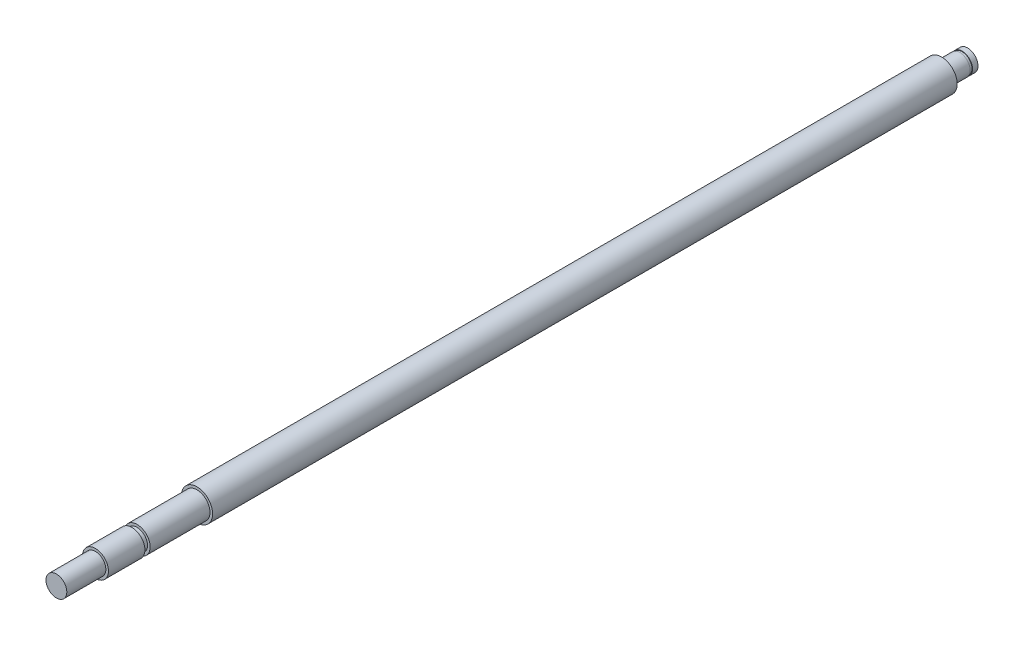
ISO-10303-21;
HEADER;
FILE_DESCRIPTION(('STEP AP214'),'2;1');
FILE_NAME('part.step','',(''),(''),'','','');
FILE_SCHEMA(('AUTOMOTIVE_DESIGN { 1 0 10303 214 1 1 1 1 }'));
ENDSEC;
DATA;
#1=APPLICATION_CONTEXT('core data for automotive mechanical design processes');
#2=APPLICATION_PROTOCOL_DEFINITION('international standard','automotive_design',2000,#1);
#3=PRODUCT_CONTEXT('',#1,'mechanical');
#4=PRODUCT('Part','Part','',(#3));
#5=PRODUCT_RELATED_PRODUCT_CATEGORY('part','',(#4));
#6=PRODUCT_DEFINITION_FORMATION('','',#4);
#7=PRODUCT_DEFINITION_CONTEXT('part definition',#1,'design');
#8=PRODUCT_DEFINITION('design','',#6,#7);
#9=PRODUCT_DEFINITION_SHAPE('','',#8);
#10=(LENGTH_UNIT() NAMED_UNIT(*) SI_UNIT(.MILLI.,.METRE.));
#11=(NAMED_UNIT(*) PLANE_ANGLE_UNIT() SI_UNIT($,.RADIAN.));
#12=(NAMED_UNIT(*) SI_UNIT($,.STERADIAN.) SOLID_ANGLE_UNIT());
#13=UNCERTAINTY_MEASURE_WITH_UNIT(LENGTH_MEASURE(1.E-05),#10,'distance_accuracy_value','');
#14=(GEOMETRIC_REPRESENTATION_CONTEXT(3) GLOBAL_UNCERTAINTY_ASSIGNED_CONTEXT((#13)) GLOBAL_UNIT_ASSIGNED_CONTEXT((#10,
#11,#12)) REPRESENTATION_CONTEXT('',''));
#15=CARTESIAN_POINT('',(0.,0.,0.));
#16=DIRECTION('',(0.,0.,1.));
#17=DIRECTION('',(1.,0.,0.));
#18=AXIS2_PLACEMENT_3D('',#15,#16,#17);
#19=CARTESIAN_POINT('',(0.,4.,197.));
#20=DIRECTION('',(0.,0.,-1.));
#21=DIRECTION('',(-1.,0.,0.));
#22=AXIS2_PLACEMENT_3D('',#19,#20,#21);
#23=PLANE('',#22);
#24=CARTESIAN_POINT('',(0.,0.,197.));
#25=DIRECTION('',(0.,0.,1.));
#26=DIRECTION('',(1.,0.,0.));
#27=AXIS2_PLACEMENT_3D('',#24,#25,#26);
#28=CIRCLE('',#27,4.);
#29=CARTESIAN_POINT('',(4.,0.,197.));
#30=VERTEX_POINT('',#29);
#31=EDGE_CURVE('E104',#30,#30,#28,.T.);
#32=ORIENTED_EDGE('',*,*,#31,.T.);
#33=EDGE_LOOP('',(#32));
#34=FACE_BOUND('',#33,.T.);
#35=ADVANCED_FACE('F37',(#34),#23,.F.);
#36=CARTESIAN_POINT('',(0.,0.,-153.));
#37=DIRECTION('',(0.,0.,1.));
#38=DIRECTION('',(1.,0.,0.));
#39=AXIS2_PLACEMENT_3D('',#36,#37,#38);
#40=PLANE('',#39);
#41=CARTESIAN_POINT('',(0.,0.,-153.));
#42=DIRECTION('',(0.,0.,1.));
#43=DIRECTION('',(1.,0.,0.));
#44=AXIS2_PLACEMENT_3D('',#41,#42,#43);
#45=CIRCLE('',#44,3.99999999999996);
#46=CARTESIAN_POINT('',(3.99999999999996,0.,-153.));
#47=VERTEX_POINT('',#46);
#48=EDGE_CURVE('E10',#47,#47,#45,.T.);
#49=ORIENTED_EDGE('',*,*,#48,.F.);
#50=EDGE_LOOP('',(#49));
#51=FACE_BOUND('',#50,.T.);
#52=ADVANCED_FACE('F195',(#51),#40,.F.);
#53=CARTESIAN_POINT('',(0.,0.,197.));
#54=DIRECTION('',(0.,0.,1.));
#55=DIRECTION('',(1.,0.,0.));
#56=AXIS2_PLACEMENT_3D('',#53,#54,#55);
#57=CYLINDRICAL_SURFACE('',#56,3.99999999999996);
#58=CARTESIAN_POINT('',(0.,0.,-150.9));
#59=DIRECTION('',(0.,0.,1.));
#60=DIRECTION('',(1.,0.,0.));
#61=AXIS2_PLACEMENT_3D('',#58,#59,#60);
#62=CIRCLE('',#61,3.99999999999996);
#63=CARTESIAN_POINT('',(3.99999999999996,0.,-150.9));
#64=VERTEX_POINT('',#63);
#65=EDGE_CURVE('E44',#64,#64,#62,.T.);
#66=ORIENTED_EDGE('',*,*,#65,.F.);
#67=EDGE_LOOP('',(#66));
#68=FACE_BOUND('',#67,.T.);
#69=ORIENTED_EDGE('',*,*,#48,.T.);
#70=EDGE_LOOP('',(#69));
#71=FACE_BOUND('',#70,.T.);
#72=ADVANCED_FACE('F190',(#68,#71),#57,.T.);
#73=CARTESIAN_POINT('',(0.,3.99999999999996,-150.9));
#74=DIRECTION('',(0.,0.,-1.));
#75=DIRECTION('',(-1.,0.,0.));
#76=AXIS2_PLACEMENT_3D('',#73,#74,#75);
#77=PLANE('',#76);
#78=CARTESIAN_POINT('',(0.,0.,-150.9));
#79=DIRECTION('',(0.,0.,1.));
#80=DIRECTION('',(1.,0.,0.));
#81=AXIS2_PLACEMENT_3D('',#78,#79,#80);
#82=CIRCLE('',#81,3.79999999999996);
#83=CARTESIAN_POINT('',(3.79999999999996,0.,-150.9));
#84=VERTEX_POINT('',#83);
#85=EDGE_CURVE('E49',#84,#84,#82,.T.);
#86=ORIENTED_EDGE('',*,*,#85,.F.);
#87=EDGE_LOOP('',(#86));
#88=FACE_BOUND('',#87,.T.);
#89=ORIENTED_EDGE('',*,*,#65,.T.);
#90=EDGE_LOOP('',(#89));
#91=FACE_BOUND('',#90,.T.);
#92=ADVANCED_FACE('F185',(#88,#91),#77,.F.);
#93=CARTESIAN_POINT('',(0.,0.,197.));
#94=DIRECTION('',(0.,0.,1.));
#95=DIRECTION('',(1.,0.,0.));
#96=AXIS2_PLACEMENT_3D('',#93,#94,#95);
#97=CYLINDRICAL_SURFACE('',#96,3.79999999999996);
#98=CARTESIAN_POINT('',(0.,0.,-150.));
#99=DIRECTION('',(0.,0.,1.));
#100=DIRECTION('',(1.,0.,0.));
#101=AXIS2_PLACEMENT_3D('',#98,#99,#100);
#102=CIRCLE('',#101,3.79999999999996);
#103=CARTESIAN_POINT('',(3.79999999999996,0.,-150.));
#104=VERTEX_POINT('',#103);
#105=EDGE_CURVE('E54',#104,#104,#102,.T.);
#106=ORIENTED_EDGE('',*,*,#105,.F.);
#107=EDGE_LOOP('',(#106));
#108=FACE_BOUND('',#107,.T.);
#109=ORIENTED_EDGE('',*,*,#85,.T.);
#110=EDGE_LOOP('',(#109));
#111=FACE_BOUND('',#110,.T.);
#112=ADVANCED_FACE('F179',(#108,#111),#97,.T.);
#113=CARTESIAN_POINT('',(0.,3.79999999999996,-150.));
#114=DIRECTION('',(0.,0.,1.));
#115=DIRECTION('',(1.,0.,0.));
#116=AXIS2_PLACEMENT_3D('',#113,#114,#115);
#117=PLANE('',#116);
#118=CARTESIAN_POINT('',(0.,0.,-150.));
#119=DIRECTION('',(0.,0.,1.));
#120=DIRECTION('',(1.,0.,0.));
#121=AXIS2_PLACEMENT_3D('',#118,#119,#120);
#122=CIRCLE('',#121,3.99999999999996);
#123=CARTESIAN_POINT('',(3.99999999999996,0.,-150.));
#124=VERTEX_POINT('',#123);
#125=EDGE_CURVE('E60',#124,#124,#122,.T.);
#126=ORIENTED_EDGE('',*,*,#125,.F.);
#127=EDGE_LOOP('',(#126));
#128=FACE_BOUND('',#127,.T.);
#129=ORIENTED_EDGE('',*,*,#105,.T.);
#130=EDGE_LOOP('',(#129));
#131=FACE_BOUND('',#130,.T.);
#132=ADVANCED_FACE('F173',(#128,#131),#117,.F.);
#133=CARTESIAN_POINT('',(0.,0.,197.));
#134=DIRECTION('',(0.,0.,1.));
#135=DIRECTION('',(1.,0.,0.));
#136=AXIS2_PLACEMENT_3D('',#133,#134,#135);
#137=CYLINDRICAL_SURFACE('',#136,3.99999999999996);
#138=CARTESIAN_POINT('',(0.,0.,-143.));
#139=DIRECTION('',(0.,0.,1.));
#140=DIRECTION('',(1.,0.,0.));
#141=AXIS2_PLACEMENT_3D('',#138,#139,#140);
#142=CIRCLE('',#141,3.99999999999996);
#143=CARTESIAN_POINT('',(3.99999999999996,0.,-143.));
#144=VERTEX_POINT('',#143);
#145=EDGE_CURVE('E64',#144,#144,#142,.T.);
#146=ORIENTED_EDGE('',*,*,#145,.F.);
#147=EDGE_LOOP('',(#146));
#148=FACE_BOUND('',#147,.T.);
#149=ORIENTED_EDGE('',*,*,#125,.T.);
#150=EDGE_LOOP('',(#149));
#151=FACE_BOUND('',#150,.T.);
#152=ADVANCED_FACE('F167',(#148,#151),#137,.T.);
#153=CARTESIAN_POINT('',(0.,3.99999999999996,-143.));
#154=DIRECTION('',(0.,0.,1.));
#155=DIRECTION('',(1.,0.,0.));
#156=AXIS2_PLACEMENT_3D('',#153,#154,#155);
#157=PLANE('',#156);
#158=CARTESIAN_POINT('',(0.,0.,-143.));
#159=DIRECTION('',(0.,0.,1.));
#160=DIRECTION('',(1.,0.,0.));
#161=AXIS2_PLACEMENT_3D('',#158,#159,#160);
#162=CIRCLE('',#161,5.99999999999995);
#163=CARTESIAN_POINT('',(5.99999999999995,0.,-143.));
#164=VERTEX_POINT('',#163);
#165=EDGE_CURVE('E68',#164,#164,#162,.T.);
#166=ORIENTED_EDGE('',*,*,#165,.F.);
#167=EDGE_LOOP('',(#166));
#168=FACE_BOUND('',#167,.T.);
#169=ORIENTED_EDGE('',*,*,#145,.T.);
#170=EDGE_LOOP('',(#169));
#171=FACE_BOUND('',#170,.T.);
#172=ADVANCED_FACE('F161',(#168,#171),#157,.F.);
#173=CARTESIAN_POINT('',(0.,0.,197.));
#174=DIRECTION('',(0.,0.,1.));
#175=DIRECTION('',(1.,0.,0.));
#176=AXIS2_PLACEMENT_3D('',#173,#174,#175);
#177=CYLINDRICAL_SURFACE('',#176,5.99999999999995);
#178=CARTESIAN_POINT('',(0.,0.,143.));
#179=DIRECTION('',(0.,0.,1.));
#180=DIRECTION('',(1.,0.,0.));
#181=AXIS2_PLACEMENT_3D('',#178,#179,#180);
#182=CIRCLE('',#181,5.99999999999995);
#183=CARTESIAN_POINT('',(5.99999999999995,0.,143.));
#184=VERTEX_POINT('',#183);
#185=EDGE_CURVE('E72',#184,#184,#182,.T.);
#186=ORIENTED_EDGE('',*,*,#185,.F.);
#187=EDGE_LOOP('',(#186));
#188=FACE_BOUND('',#187,.T.);
#189=ORIENTED_EDGE('',*,*,#165,.T.);
#190=EDGE_LOOP('',(#189));
#191=FACE_BOUND('',#190,.T.);
#192=ADVANCED_FACE('F155',(#188,#191),#177,.T.);
#193=CARTESIAN_POINT('',(0.,5.99999999999995,143.));
#194=DIRECTION('',(0.,0.,-1.));
#195=DIRECTION('',(-1.,0.,0.));
#196=AXIS2_PLACEMENT_3D('',#193,#194,#195);
#197=PLANE('',#196);
#198=CARTESIAN_POINT('',(0.,0.,143.));
#199=DIRECTION('',(0.,0.,1.));
#200=DIRECTION('',(1.,0.,0.));
#201=AXIS2_PLACEMENT_3D('',#198,#199,#200);
#202=CIRCLE('',#201,5.00000000000001);
#203=CARTESIAN_POINT('',(5.00000000000001,0.,143.));
#204=VERTEX_POINT('',#203);
#205=EDGE_CURVE('E76',#204,#204,#202,.T.);
#206=ORIENTED_EDGE('',*,*,#205,.F.);
#207=EDGE_LOOP('',(#206));
#208=FACE_BOUND('',#207,.T.);
#209=ORIENTED_EDGE('',*,*,#185,.T.);
#210=EDGE_LOOP('',(#209));
#211=FACE_BOUND('',#210,.T.);
#212=ADVANCED_FACE('F149',(#208,#211),#197,.F.);
#213=CARTESIAN_POINT('',(0.,0.,197.));
#214=DIRECTION('',(0.,0.,1.));
#215=DIRECTION('',(1.,0.,0.));
#216=AXIS2_PLACEMENT_3D('',#213,#214,#215);
#217=CYLINDRICAL_SURFACE('',#216,5.00000000000001);
#218=CARTESIAN_POINT('',(0.,0.,166.));
#219=DIRECTION('',(0.,0.,1.));
#220=DIRECTION('',(1.,0.,0.));
#221=AXIS2_PLACEMENT_3D('',#218,#219,#220);
#222=CIRCLE('',#221,5.);
#223=CARTESIAN_POINT('',(5.,0.,166.));
#224=VERTEX_POINT('',#223);
#225=EDGE_CURVE('E80',#224,#224,#222,.T.);
#226=ORIENTED_EDGE('',*,*,#225,.F.);
#227=EDGE_LOOP('',(#226));
#228=FACE_BOUND('',#227,.T.);
#229=ORIENTED_EDGE('',*,*,#205,.T.);
#230=EDGE_LOOP('',(#229));
#231=FACE_BOUND('',#230,.T.);
#232=ADVANCED_FACE('F143',(#228,#231),#217,.T.);
#233=CARTESIAN_POINT('',(0.,5.,166.));
#234=DIRECTION('',(0.,0.,-1.));
#235=DIRECTION('',(-1.,0.,0.));
#236=AXIS2_PLACEMENT_3D('',#233,#234,#235);
#237=PLANE('',#236);
#238=CARTESIAN_POINT('',(0.,0.,166.));
#239=DIRECTION('',(0.,0.,1.));
#240=DIRECTION('',(1.,0.,0.));
#241=AXIS2_PLACEMENT_3D('',#238,#239,#240);
#242=CIRCLE('',#241,4.);
#243=CARTESIAN_POINT('',(4.,0.,166.));
#244=VERTEX_POINT('',#243);
#245=EDGE_CURVE('E84',#244,#244,#242,.T.);
#246=ORIENTED_EDGE('',*,*,#245,.F.);
#247=EDGE_LOOP('',(#246));
#248=FACE_BOUND('',#247,.T.);
#249=ORIENTED_EDGE('',*,*,#225,.T.);
#250=EDGE_LOOP('',(#249));
#251=FACE_BOUND('',#250,.T.);
#252=ADVANCED_FACE('F137',(#248,#251),#237,.F.);
#253=CARTESIAN_POINT('',(0.,0.,197.));
#254=DIRECTION('',(0.,0.,1.));
#255=DIRECTION('',(1.,0.,0.));
#256=AXIS2_PLACEMENT_3D('',#253,#254,#255);
#257=CYLINDRICAL_SURFACE('',#256,4.);
#258=CARTESIAN_POINT('',(0.,0.,168.));
#259=DIRECTION('',(0.,0.,1.));
#260=DIRECTION('',(1.,0.,0.));
#261=AXIS2_PLACEMENT_3D('',#258,#259,#260);
#262=CIRCLE('',#261,4.);
#263=CARTESIAN_POINT('',(4.,0.,168.));
#264=VERTEX_POINT('',#263);
#265=EDGE_CURVE('E88',#264,#264,#262,.T.);
#266=ORIENTED_EDGE('',*,*,#265,.F.);
#267=EDGE_LOOP('',(#266));
#268=FACE_BOUND('',#267,.T.);
#269=ORIENTED_EDGE('',*,*,#245,.T.);
#270=EDGE_LOOP('',(#269));
#271=FACE_BOUND('',#270,.T.);
#272=ADVANCED_FACE('F131',(#268,#271),#257,.T.);
#273=CARTESIAN_POINT('',(0.,4.,168.));
#274=DIRECTION('',(0.,0.,1.));
#275=DIRECTION('',(1.,0.,0.));
#276=AXIS2_PLACEMENT_3D('',#273,#274,#275);
#277=PLANE('',#276);
#278=CARTESIAN_POINT('',(0.,0.,168.));
#279=DIRECTION('',(0.,0.,1.));
#280=DIRECTION('',(1.,0.,0.));
#281=AXIS2_PLACEMENT_3D('',#278,#279,#280);
#282=CIRCLE('',#281,5.);
#283=CARTESIAN_POINT('',(5.,0.,168.));
#284=VERTEX_POINT('',#283);
#285=EDGE_CURVE('E92',#284,#284,#282,.T.);
#286=ORIENTED_EDGE('',*,*,#285,.F.);
#287=EDGE_LOOP('',(#286));
#288=FACE_BOUND('',#287,.T.);
#289=ORIENTED_EDGE('',*,*,#265,.T.);
#290=EDGE_LOOP('',(#289));
#291=FACE_BOUND('',#290,.T.);
#292=ADVANCED_FACE('F125',(#288,#291),#277,.F.);
#293=CARTESIAN_POINT('',(0.,0.,197.));
#294=DIRECTION('',(0.,0.,1.));
#295=DIRECTION('',(1.,0.,0.));
#296=AXIS2_PLACEMENT_3D('',#293,#294,#295);
#297=CYLINDRICAL_SURFACE('',#296,5.);
#298=CARTESIAN_POINT('',(0.,0.,182.));
#299=DIRECTION('',(0.,0.,1.));
#300=DIRECTION('',(1.,0.,0.));
#301=AXIS2_PLACEMENT_3D('',#298,#299,#300);
#302=CIRCLE('',#301,5.);
#303=CARTESIAN_POINT('',(5.,0.,182.));
#304=VERTEX_POINT('',#303);
#305=EDGE_CURVE('E96',#304,#304,#302,.T.);
#306=ORIENTED_EDGE('',*,*,#305,.F.);
#307=EDGE_LOOP('',(#306));
#308=FACE_BOUND('',#307,.T.);
#309=ORIENTED_EDGE('',*,*,#285,.T.);
#310=EDGE_LOOP('',(#309));
#311=FACE_BOUND('',#310,.T.);
#312=ADVANCED_FACE('F119',(#308,#311),#297,.T.);
#313=CARTESIAN_POINT('',(0.,5.,182.));
#314=DIRECTION('',(0.,0.,-1.));
#315=DIRECTION('',(-1.,0.,0.));
#316=AXIS2_PLACEMENT_3D('',#313,#314,#315);
#317=PLANE('',#316);
#318=CARTESIAN_POINT('',(0.,0.,182.));
#319=DIRECTION('',(0.,0.,1.));
#320=DIRECTION('',(1.,0.,0.));
#321=AXIS2_PLACEMENT_3D('',#318,#319,#320);
#322=CIRCLE('',#321,4.);
#323=CARTESIAN_POINT('',(4.,0.,182.));
#324=VERTEX_POINT('',#323);
#325=EDGE_CURVE('E100',#324,#324,#322,.T.);
#326=ORIENTED_EDGE('',*,*,#325,.F.);
#327=EDGE_LOOP('',(#326));
#328=FACE_BOUND('',#327,.T.);
#329=ORIENTED_EDGE('',*,*,#305,.T.);
#330=EDGE_LOOP('',(#329));
#331=FACE_BOUND('',#330,.T.);
#332=ADVANCED_FACE('F113',(#328,#331),#317,.F.);
#333=CARTESIAN_POINT('',(0.,0.,197.));
#334=DIRECTION('',(0.,0.,1.));
#335=DIRECTION('',(1.,0.,0.));
#336=AXIS2_PLACEMENT_3D('',#333,#334,#335);
#337=CYLINDRICAL_SURFACE('',#336,4.);
#338=ORIENTED_EDGE('',*,*,#31,.F.);
#339=EDGE_LOOP('',(#338));
#340=FACE_BOUND('',#339,.T.);
#341=ORIENTED_EDGE('',*,*,#325,.T.);
#342=EDGE_LOOP('',(#341));
#343=FACE_BOUND('',#342,.T.);
#344=ADVANCED_FACE('F110',(#340,#343),#337,.T.);
#345=CLOSED_SHELL('',(#35,#52,#72,#92,#112,#132,#152,#172,#192,#212,#232,#252,#272,#292,#312,
#332,#344));
#346=MANIFOLD_SOLID_BREP('B2',#345);
#347=ADVANCED_BREP_SHAPE_REPRESENTATION('',(#18,#346),#14);
#348=SHAPE_DEFINITION_REPRESENTATION(#9,#347);
ENDSEC;
END-ISO-10303-21;
